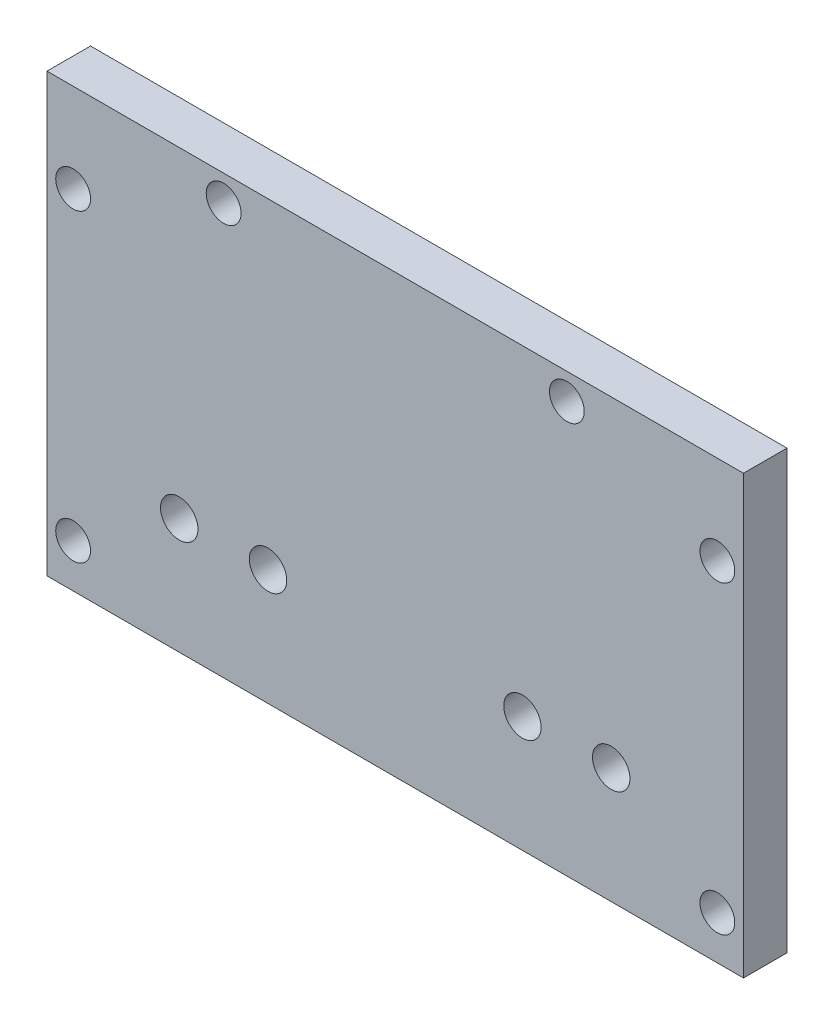
ISO-10303-21;
HEADER;
FILE_DESCRIPTION(('STEP AP214'),'2;1');
FILE_NAME('part.step','',(''),(''),'','','');
FILE_SCHEMA(('AUTOMOTIVE_DESIGN { 1 0 10303 214 1 1 1 1 }'));
ENDSEC;
DATA;
#1=APPLICATION_CONTEXT('core data for automotive mechanical design processes');
#2=APPLICATION_PROTOCOL_DEFINITION('international standard','automotive_design',2000,#1);
#3=PRODUCT_CONTEXT('',#1,'mechanical');
#4=PRODUCT('Part','Part','',(#3));
#5=PRODUCT_RELATED_PRODUCT_CATEGORY('part','',(#4));
#6=PRODUCT_DEFINITION_FORMATION('','',#4);
#7=PRODUCT_DEFINITION_CONTEXT('part definition',#1,'design');
#8=PRODUCT_DEFINITION('design','',#6,#7);
#9=PRODUCT_DEFINITION_SHAPE('','',#8);
#10=(LENGTH_UNIT() NAMED_UNIT(*) SI_UNIT(.MILLI.,.METRE.));
#11=(NAMED_UNIT(*) PLANE_ANGLE_UNIT() SI_UNIT($,.RADIAN.));
#12=(NAMED_UNIT(*) SI_UNIT($,.STERADIAN.) SOLID_ANGLE_UNIT());
#13=UNCERTAINTY_MEASURE_WITH_UNIT(LENGTH_MEASURE(1.E-05),#10,'distance_accuracy_value','');
#14=(GEOMETRIC_REPRESENTATION_CONTEXT(3) GLOBAL_UNCERTAINTY_ASSIGNED_CONTEXT((#13)) GLOBAL_UNIT_ASSIGNED_CONTEXT((#10,
#11,#12)) REPRESENTATION_CONTEXT('',''));
#15=CARTESIAN_POINT('',(0.,0.,0.));
#16=DIRECTION('',(0.,0.,1.));
#17=DIRECTION('',(1.,0.,0.));
#18=AXIS2_PLACEMENT_3D('',#15,#16,#17);
#19=CARTESIAN_POINT('',(0.,0.,5.));
#20=DIRECTION('',(0.,0.,-1.));
#21=DIRECTION('',(-1.,0.,0.));
#22=AXIS2_PLACEMENT_3D('',#19,#20,#21);
#23=PLANE('',#22);
#24=CARTESIAN_POINT('',(-37.,4.99999999999999,5.));
#25=DIRECTION('',(0.,0.,-1.));
#26=DIRECTION('',(-1.,0.,0.));
#27=AXIS2_PLACEMENT_3D('',#24,#25,#26);
#28=CIRCLE('',#27,2.);
#29=CARTESIAN_POINT('',(-39.,4.99999999999999,5.));
#30=VERTEX_POINT('',#29);
#31=EDGE_CURVE('E133',#30,#30,#28,.T.);
#32=ORIENTED_EDGE('',*,*,#31,.T.);
#33=EDGE_LOOP('',(#32));
#34=FACE_BOUND('',#33,.T.);
#35=CARTESIAN_POINT('',(37.,40.,5.));
#36=DIRECTION('',(0.,0.,-1.));
#37=DIRECTION('',(-1.,0.,0.));
#38=AXIS2_PLACEMENT_3D('',#35,#36,#37);
#39=CIRCLE('',#38,2.);
#40=CARTESIAN_POINT('',(35.,40.,5.));
#41=VERTEX_POINT('',#40);
#42=EDGE_CURVE('E138',#41,#41,#39,.T.);
#43=ORIENTED_EDGE('',*,*,#42,.T.);
#44=EDGE_LOOP('',(#43));
#45=FACE_BOUND('',#44,.T.);
#46=CARTESIAN_POINT('',(-37.,40.,5.));
#47=DIRECTION('',(0.,0.,-1.));
#48=DIRECTION('',(-1.,0.,0.));
#49=AXIS2_PLACEMENT_3D('',#46,#47,#48);
#50=CIRCLE('',#49,2.);
#51=CARTESIAN_POINT('',(-39.,40.,5.));
#52=VERTEX_POINT('',#51);
#53=EDGE_CURVE('E141',#52,#52,#50,.T.);
#54=ORIENTED_EDGE('',*,*,#53,.T.);
#55=EDGE_LOOP('',(#54));
#56=FACE_BOUND('',#55,.T.);
#57=CARTESIAN_POINT('',(19.7107385273617,47.2111998450075,5.));
#58=DIRECTION('',(0.,0.,-1.));
#59=DIRECTION('',(-1.,0.,0.));
#60=AXIS2_PLACEMENT_3D('',#57,#58,#59);
#61=CIRCLE('',#60,2.);
#62=CARTESIAN_POINT('',(17.7107385273617,47.2111998450075,5.));
#63=VERTEX_POINT('',#62);
#64=EDGE_CURVE('E144',#63,#63,#61,.T.);
#65=ORIENTED_EDGE('',*,*,#64,.T.);
#66=EDGE_LOOP('',(#65));
#67=FACE_BOUND('',#66,.T.);
#68=CARTESIAN_POINT('',(37.,4.99999999999998,5.));
#69=DIRECTION('',(0.,0.,-1.));
#70=DIRECTION('',(-1.,0.,0.));
#71=AXIS2_PLACEMENT_3D('',#68,#69,#70);
#72=CIRCLE('',#71,2.);
#73=CARTESIAN_POINT('',(35.,4.99999999999998,5.));
#74=VERTEX_POINT('',#73);
#75=EDGE_CURVE('E147',#74,#74,#72,.T.);
#76=ORIENTED_EDGE('',*,*,#75,.T.);
#77=EDGE_LOOP('',(#76));
#78=FACE_BOUND('',#77,.T.);
#79=CARTESIAN_POINT('',(-19.7107385273617,47.2111998450075,5.));
#80=DIRECTION('',(0.,0.,-1.));
#81=DIRECTION('',(-1.,0.,0.));
#82=AXIS2_PLACEMENT_3D('',#79,#80,#81);
#83=CIRCLE('',#82,2.);
#84=CARTESIAN_POINT('',(-21.7107385273617,47.2111998450075,5.));
#85=VERTEX_POINT('',#84);
#86=EDGE_CURVE('E150',#85,#85,#83,.T.);
#87=ORIENTED_EDGE('',*,*,#86,.T.);
#88=EDGE_LOOP('',(#87));
#89=FACE_BOUND('',#88,.T.);
#90=DIRECTION('',(0.,-1.,0.));
#91=VECTOR('',#90,1.);
#92=CARTESIAN_POINT('',(-40.,0.,5.));
#93=LINE('',#92,#91);
#94=CARTESIAN_POINT('',(-40.,50.2111998450075,5.));
#95=VERTEX_POINT('',#94);
#96=CARTESIAN_POINT('',(-40.,0.,5.));
#97=VERTEX_POINT('',#96);
#98=EDGE_CURVE('E85',#95,#97,#93,.T.);
#99=ORIENTED_EDGE('',*,*,#98,.T.);
#100=DIRECTION('',(1.,0.,0.));
#101=VECTOR('',#100,1.);
#102=CARTESIAN_POINT('',(40.,0.,5.));
#103=LINE('',#102,#101);
#104=CARTESIAN_POINT('',(40.,0.,5.));
#105=VERTEX_POINT('',#104);
#106=EDGE_CURVE('E80',#97,#105,#103,.T.);
#107=ORIENTED_EDGE('',*,*,#106,.T.);
#108=DIRECTION('',(0.,1.,0.));
#109=VECTOR('',#108,1.);
#110=CARTESIAN_POINT('',(40.,50.2111998450075,5.));
#111=LINE('',#110,#109);
#112=CARTESIAN_POINT('',(40.,50.2111998450075,5.));
#113=VERTEX_POINT('',#112);
#114=EDGE_CURVE('E83',#105,#113,#111,.T.);
#115=ORIENTED_EDGE('',*,*,#114,.T.);
#116=DIRECTION('',(-1.,0.,0.));
#117=VECTOR('',#116,1.);
#118=CARTESIAN_POINT('',(-40.,50.2111998450075,5.));
#119=LINE('',#118,#117);
#120=EDGE_CURVE('E50',#113,#95,#119,.T.);
#121=ORIENTED_EDGE('',*,*,#120,.T.);
#122=EDGE_LOOP('',(#99,#107,#115,#121));
#123=FACE_BOUND('',#122,.T.);
#124=CARTESIAN_POINT('',(14.6107385273617,13.3111998450076,5.));
#125=DIRECTION('',(0.,0.,1.));
#126=DIRECTION('',(1.,0.,0.));
#127=AXIS2_PLACEMENT_3D('',#124,#125,#126);
#128=CIRCLE('',#127,2.15);
#129=CARTESIAN_POINT('',(16.7607385273617,13.3111998450076,5.));
#130=VERTEX_POINT('',#129);
#131=EDGE_CURVE('E100',#130,#130,#128,.T.);
#132=ORIENTED_EDGE('',*,*,#131,.F.);
#133=EDGE_LOOP('',(#132));
#134=FACE_BOUND('',#133,.T.);
#135=CARTESIAN_POINT('',(24.8107385273617,13.3111998450076,5.));
#136=DIRECTION('',(0.,0.,1.));
#137=DIRECTION('',(1.,0.,0.));
#138=AXIS2_PLACEMENT_3D('',#135,#136,#137);
#139=CIRCLE('',#138,2.15);
#140=CARTESIAN_POINT('',(26.9607385273617,13.3111998450076,5.));
#141=VERTEX_POINT('',#140);
#142=EDGE_CURVE('E115',#141,#141,#139,.T.);
#143=ORIENTED_EDGE('',*,*,#142,.F.);
#144=EDGE_LOOP('',(#143));
#145=FACE_BOUND('',#144,.T.);
#146=CARTESIAN_POINT('',(-14.6107385273616,13.3111998450077,5.));
#147=DIRECTION('',(0.,0.,1.));
#148=DIRECTION('',(1.,0.,0.));
#149=AXIS2_PLACEMENT_3D('',#146,#147,#148);
#150=CIRCLE('',#149,2.15);
#151=CARTESIAN_POINT('',(-12.4607385273616,13.3111998450077,5.));
#152=VERTEX_POINT('',#151);
#153=EDGE_CURVE('E121',#152,#152,#150,.T.);
#154=ORIENTED_EDGE('',*,*,#153,.F.);
#155=EDGE_LOOP('',(#154));
#156=FACE_BOUND('',#155,.T.);
#157=CARTESIAN_POINT('',(-24.8107385273616,13.3111998450077,5.));
#158=DIRECTION('',(0.,0.,1.));
#159=DIRECTION('',(1.,0.,0.));
#160=AXIS2_PLACEMENT_3D('',#157,#158,#159);
#161=CIRCLE('',#160,2.15);
#162=CARTESIAN_POINT('',(-22.6607385273616,13.3111998450077,5.));
#163=VERTEX_POINT('',#162);
#164=EDGE_CURVE('E127',#163,#163,#161,.T.);
#165=ORIENTED_EDGE('',*,*,#164,.F.);
#166=EDGE_LOOP('',(#165));
#167=FACE_BOUND('',#166,.T.);
#168=ADVANCED_FACE('F33',(#34,#45,#56,#67,#78,#89,#123,#134,#145,#156,#167),#23,.F.);
#169=CARTESIAN_POINT('',(0.,0.,0.));
#170=DIRECTION('',(0.,0.,-1.));
#171=DIRECTION('',(-1.,0.,0.));
#172=AXIS2_PLACEMENT_3D('',#169,#170,#171);
#173=PLANE('',#172);
#174=CARTESIAN_POINT('',(-37.,4.99999999999999,0.));
#175=DIRECTION('',(0.,0.,-1.));
#176=DIRECTION('',(-1.,0.,0.));
#177=AXIS2_PLACEMENT_3D('',#174,#175,#176);
#178=CIRCLE('',#177,2.);
#179=CARTESIAN_POINT('',(-39.,4.99999999999999,0.));
#180=VERTEX_POINT('',#179);
#181=EDGE_CURVE('E163',#180,#180,#178,.T.);
#182=ORIENTED_EDGE('',*,*,#181,.F.);
#183=EDGE_LOOP('',(#182));
#184=FACE_BOUND('',#183,.T.);
#185=CARTESIAN_POINT('',(37.,40.,0.));
#186=DIRECTION('',(0.,0.,-1.));
#187=DIRECTION('',(-1.,0.,0.));
#188=AXIS2_PLACEMENT_3D('',#185,#186,#187);
#189=CIRCLE('',#188,2.);
#190=CARTESIAN_POINT('',(35.,40.,0.));
#191=VERTEX_POINT('',#190);
#192=EDGE_CURVE('E160',#191,#191,#189,.T.);
#193=ORIENTED_EDGE('',*,*,#192,.F.);
#194=EDGE_LOOP('',(#193));
#195=FACE_BOUND('',#194,.T.);
#196=CARTESIAN_POINT('',(-37.,40.,0.));
#197=DIRECTION('',(0.,0.,-1.));
#198=DIRECTION('',(-1.,0.,0.));
#199=AXIS2_PLACEMENT_3D('',#196,#197,#198);
#200=CIRCLE('',#199,2.);
#201=CARTESIAN_POINT('',(-39.,40.,0.));
#202=VERTEX_POINT('',#201);
#203=EDGE_CURVE('E157',#202,#202,#200,.T.);
#204=ORIENTED_EDGE('',*,*,#203,.F.);
#205=EDGE_LOOP('',(#204));
#206=FACE_BOUND('',#205,.T.);
#207=CARTESIAN_POINT('',(19.7107385273617,47.2111998450075,0.));
#208=DIRECTION('',(0.,0.,-1.));
#209=DIRECTION('',(1.,0.,0.));
#210=AXIS2_PLACEMENT_3D('',#207,#208,#209);
#211=CIRCLE('',#210,2.);
#212=CARTESIAN_POINT('',(21.7107385273617,47.2111998450075,0.));
#213=VERTEX_POINT('',#212);
#214=EDGE_CURVE('E156',#213,#213,#211,.T.);
#215=ORIENTED_EDGE('',*,*,#214,.F.);
#216=EDGE_LOOP('',(#215));
#217=FACE_BOUND('',#216,.T.);
#218=CARTESIAN_POINT('',(37.,4.99999999999998,0.));
#219=DIRECTION('',(0.,0.,-1.));
#220=DIRECTION('',(1.,0.,0.));
#221=AXIS2_PLACEMENT_3D('',#218,#219,#220);
#222=CIRCLE('',#221,2.);
#223=CARTESIAN_POINT('',(39.,4.99999999999998,0.));
#224=VERTEX_POINT('',#223);
#225=EDGE_CURVE('E166',#224,#224,#222,.T.);
#226=ORIENTED_EDGE('',*,*,#225,.F.);
#227=EDGE_LOOP('',(#226));
#228=FACE_BOUND('',#227,.T.);
#229=CARTESIAN_POINT('',(-19.7107385273617,47.2111998450075,0.));
#230=DIRECTION('',(0.,0.,-1.));
#231=DIRECTION('',(-1.,0.,0.));
#232=AXIS2_PLACEMENT_3D('',#229,#230,#231);
#233=CIRCLE('',#232,2.);
#234=CARTESIAN_POINT('',(-21.7107385273617,47.2111998450075,0.));
#235=VERTEX_POINT('',#234);
#236=EDGE_CURVE('E153',#235,#235,#233,.T.);
#237=ORIENTED_EDGE('',*,*,#236,.F.);
#238=EDGE_LOOP('',(#237));
#239=FACE_BOUND('',#238,.T.);
#240=CARTESIAN_POINT('',(-14.6107385273616,13.3111998450077,0.));
#241=DIRECTION('',(0.,0.,1.));
#242=DIRECTION('',(1.,0.,0.));
#243=AXIS2_PLACEMENT_3D('',#240,#241,#242);
#244=CIRCLE('',#243,2.15);
#245=CARTESIAN_POINT('',(-12.4607385273616,13.3111998450077,0.));
#246=VERTEX_POINT('',#245);
#247=EDGE_CURVE('E124',#246,#246,#244,.T.);
#248=ORIENTED_EDGE('',*,*,#247,.T.);
#249=EDGE_LOOP('',(#248));
#250=FACE_BOUND('',#249,.T.);
#251=CARTESIAN_POINT('',(14.6107385273617,13.3111998450076,0.));
#252=DIRECTION('',(0.,0.,1.));
#253=DIRECTION('',(1.,0.,0.));
#254=AXIS2_PLACEMENT_3D('',#251,#252,#253);
#255=CIRCLE('',#254,2.15);
#256=CARTESIAN_POINT('',(16.7607385273617,13.3111998450076,0.));
#257=VERTEX_POINT('',#256);
#258=EDGE_CURVE('E112',#257,#257,#255,.T.);
#259=ORIENTED_EDGE('',*,*,#258,.T.);
#260=EDGE_LOOP('',(#259));
#261=FACE_BOUND('',#260,.T.);
#262=DIRECTION('',(0.,-1.,0.));
#263=VECTOR('',#262,1.);
#264=CARTESIAN_POINT('',(-40.,0.,0.));
#265=LINE('',#264,#263);
#266=CARTESIAN_POINT('',(-40.,50.2111998450075,0.));
#267=VERTEX_POINT('',#266);
#268=CARTESIAN_POINT('',(-40.,0.,0.));
#269=VERTEX_POINT('',#268);
#270=EDGE_CURVE('E97',#267,#269,#265,.T.);
#271=ORIENTED_EDGE('',*,*,#270,.F.);
#272=DIRECTION('',(-1.,0.,0.));
#273=VECTOR('',#272,1.);
#274=CARTESIAN_POINT('',(-40.,50.2111998450075,0.));
#275=LINE('',#274,#273);
#276=CARTESIAN_POINT('',(40.,50.2111998450075,0.));
#277=VERTEX_POINT('',#276);
#278=EDGE_CURVE('E73',#277,#267,#275,.T.);
#279=ORIENTED_EDGE('',*,*,#278,.F.);
#280=DIRECTION('',(0.,1.,0.));
#281=VECTOR('',#280,1.);
#282=CARTESIAN_POINT('',(40.,50.2111998450075,0.));
#283=LINE('',#282,#281);
#284=CARTESIAN_POINT('',(40.,0.,0.));
#285=VERTEX_POINT('',#284);
#286=EDGE_CURVE('E67',#285,#277,#283,.T.);
#287=ORIENTED_EDGE('',*,*,#286,.F.);
#288=DIRECTION('',(1.,0.,0.));
#289=VECTOR('',#288,1.);
#290=CARTESIAN_POINT('',(40.,0.,0.));
#291=LINE('',#290,#289);
#292=EDGE_CURVE('E89',#269,#285,#291,.T.);
#293=ORIENTED_EDGE('',*,*,#292,.F.);
#294=EDGE_LOOP('',(#271,#279,#287,#293));
#295=FACE_BOUND('',#294,.T.);
#296=CARTESIAN_POINT('',(24.8107385273617,13.3111998450076,0.));
#297=DIRECTION('',(0.,0.,1.));
#298=DIRECTION('',(1.,0.,0.));
#299=AXIS2_PLACEMENT_3D('',#296,#297,#298);
#300=CIRCLE('',#299,2.15);
#301=CARTESIAN_POINT('',(26.9607385273617,13.3111998450076,0.));
#302=VERTEX_POINT('',#301);
#303=EDGE_CURVE('E118',#302,#302,#300,.T.);
#304=ORIENTED_EDGE('',*,*,#303,.T.);
#305=EDGE_LOOP('',(#304));
#306=FACE_BOUND('',#305,.T.);
#307=CARTESIAN_POINT('',(-24.8107385273616,13.3111998450077,0.));
#308=DIRECTION('',(0.,0.,1.));
#309=DIRECTION('',(1.,0.,0.));
#310=AXIS2_PLACEMENT_3D('',#307,#308,#309);
#311=CIRCLE('',#310,2.15);
#312=CARTESIAN_POINT('',(-22.6607385273616,13.3111998450077,0.));
#313=VERTEX_POINT('',#312);
#314=EDGE_CURVE('E130',#313,#313,#311,.T.);
#315=ORIENTED_EDGE('',*,*,#314,.T.);
#316=EDGE_LOOP('',(#315));
#317=FACE_BOUND('',#316,.T.);
#318=ADVANCED_FACE('F108',(#184,#195,#206,#217,#228,#239,#250,#261,#295,#306,#317),#173,.T.);
#319=CARTESIAN_POINT('',(-40.,0.,5.));
#320=DIRECTION('',(1.,0.,0.));
#321=DIRECTION('',(0.,1.,0.));
#322=AXIS2_PLACEMENT_3D('',#319,#320,#321);
#323=PLANE('',#322);
#324=ORIENTED_EDGE('',*,*,#270,.T.);
#325=DIRECTION('',(0.,0.,-1.));
#326=VECTOR('',#325,1.);
#327=CARTESIAN_POINT('',(-40.,0.,5.));
#328=LINE('',#327,#326);
#329=EDGE_CURVE('E11',#97,#269,#328,.T.);
#330=ORIENTED_EDGE('',*,*,#329,.F.);
#331=ORIENTED_EDGE('',*,*,#98,.F.);
#332=DIRECTION('',(0.,0.,-1.));
#333=VECTOR('',#332,1.);
#334=CARTESIAN_POINT('',(-40.,50.2111998450075,5.));
#335=LINE('',#334,#333);
#336=EDGE_CURVE('E93',#95,#267,#335,.T.);
#337=ORIENTED_EDGE('',*,*,#336,.T.);
#338=EDGE_LOOP('',(#324,#330,#331,#337));
#339=FACE_BOUND('',#338,.T.);
#340=ADVANCED_FACE('F35',(#339),#323,.F.);
#341=CARTESIAN_POINT('',(40.,0.,5.));
#342=DIRECTION('',(0.,1.,0.));
#343=DIRECTION('',(-1.,0.,0.));
#344=AXIS2_PLACEMENT_3D('',#341,#342,#343);
#345=PLANE('',#344);
#346=ORIENTED_EDGE('',*,*,#292,.T.);
#347=DIRECTION('',(0.,0.,-1.));
#348=VECTOR('',#347,1.);
#349=CARTESIAN_POINT('',(40.,0.,5.));
#350=LINE('',#349,#348);
#351=EDGE_CURVE('E42',#105,#285,#350,.T.);
#352=ORIENTED_EDGE('',*,*,#351,.F.);
#353=ORIENTED_EDGE('',*,*,#106,.F.);
#354=ORIENTED_EDGE('',*,*,#329,.T.);
#355=EDGE_LOOP('',(#346,#352,#353,#354));
#356=FACE_BOUND('',#355,.T.);
#357=ADVANCED_FACE('F88',(#356),#345,.F.);
#358=CARTESIAN_POINT('',(40.,50.2111998450075,5.));
#359=DIRECTION('',(-1.,0.,0.));
#360=DIRECTION('',(0.,0.,1.));
#361=AXIS2_PLACEMENT_3D('',#358,#359,#360);
#362=PLANE('',#361);
#363=ORIENTED_EDGE('',*,*,#286,.T.);
#364=DIRECTION('',(0.,0.,-1.));
#365=VECTOR('',#364,1.);
#366=CARTESIAN_POINT('',(40.,50.2111998450075,5.));
#367=LINE('',#366,#365);
#368=EDGE_CURVE('E90',#113,#277,#367,.T.);
#369=ORIENTED_EDGE('',*,*,#368,.F.);
#370=ORIENTED_EDGE('',*,*,#114,.F.);
#371=ORIENTED_EDGE('',*,*,#351,.T.);
#372=EDGE_LOOP('',(#363,#369,#370,#371));
#373=FACE_BOUND('',#372,.T.);
#374=ADVANCED_FACE('F91',(#373),#362,.F.);
#375=CARTESIAN_POINT('',(-40.,50.2111998450075,5.));
#376=DIRECTION('',(0.,-1.,0.));
#377=DIRECTION('',(1.,0.,0.));
#378=AXIS2_PLACEMENT_3D('',#375,#376,#377);
#379=PLANE('',#378);
#380=ORIENTED_EDGE('',*,*,#278,.T.);
#381=ORIENTED_EDGE('',*,*,#336,.F.);
#382=ORIENTED_EDGE('',*,*,#120,.F.);
#383=ORIENTED_EDGE('',*,*,#368,.T.);
#384=EDGE_LOOP('',(#380,#381,#382,#383));
#385=FACE_BOUND('',#384,.T.);
#386=ADVANCED_FACE('F105',(#385),#379,.F.);
#387=CARTESIAN_POINT('',(14.6107385273617,13.3111998450076,5.));
#388=DIRECTION('',(0.,0.,-1.));
#389=DIRECTION('',(-1.,0.,0.));
#390=AXIS2_PLACEMENT_3D('',#387,#388,#389);
#391=CYLINDRICAL_SURFACE('',#390,2.15);
#392=ORIENTED_EDGE('',*,*,#131,.T.);
#393=EDGE_LOOP('',(#392));
#394=FACE_BOUND('',#393,.T.);
#395=ORIENTED_EDGE('',*,*,#258,.F.);
#396=EDGE_LOOP('',(#395));
#397=FACE_BOUND('',#396,.T.);
#398=ADVANCED_FACE('F185',(#394,#397),#391,.F.);
#399=CARTESIAN_POINT('',(24.8107385273617,13.3111998450076,5.));
#400=DIRECTION('',(0.,0.,-1.));
#401=DIRECTION('',(-1.,0.,0.));
#402=AXIS2_PLACEMENT_3D('',#399,#400,#401);
#403=CYLINDRICAL_SURFACE('',#402,2.15);
#404=ORIENTED_EDGE('',*,*,#142,.T.);
#405=EDGE_LOOP('',(#404));
#406=FACE_BOUND('',#405,.T.);
#407=ORIENTED_EDGE('',*,*,#303,.F.);
#408=EDGE_LOOP('',(#407));
#409=FACE_BOUND('',#408,.T.);
#410=ADVANCED_FACE('F187',(#406,#409),#403,.F.);
#411=CARTESIAN_POINT('',(-14.6107385273616,13.3111998450077,5.));
#412=DIRECTION('',(0.,0.,-1.));
#413=DIRECTION('',(-1.,0.,0.));
#414=AXIS2_PLACEMENT_3D('',#411,#412,#413);
#415=CYLINDRICAL_SURFACE('',#414,2.15);
#416=ORIENTED_EDGE('',*,*,#153,.T.);
#417=EDGE_LOOP('',(#416));
#418=FACE_BOUND('',#417,.T.);
#419=ORIENTED_EDGE('',*,*,#247,.F.);
#420=EDGE_LOOP('',(#419));
#421=FACE_BOUND('',#420,.T.);
#422=ADVANCED_FACE('F194',(#418,#421),#415,.F.);
#423=CARTESIAN_POINT('',(-24.8107385273616,13.3111998450077,5.));
#424=DIRECTION('',(0.,0.,-1.));
#425=DIRECTION('',(-1.,0.,0.));
#426=AXIS2_PLACEMENT_3D('',#423,#424,#425);
#427=CYLINDRICAL_SURFACE('',#426,2.15);
#428=ORIENTED_EDGE('',*,*,#164,.T.);
#429=EDGE_LOOP('',(#428));
#430=FACE_BOUND('',#429,.T.);
#431=ORIENTED_EDGE('',*,*,#314,.F.);
#432=EDGE_LOOP('',(#431));
#433=FACE_BOUND('',#432,.T.);
#434=ADVANCED_FACE('F229',(#430,#433),#427,.F.);
#435=CARTESIAN_POINT('',(-19.7107385273617,47.2111998450075,10.));
#436=DIRECTION('',(0.,0.,-1.));
#437=DIRECTION('',(-1.,0.,0.));
#438=AXIS2_PLACEMENT_3D('',#435,#436,#437);
#439=CYLINDRICAL_SURFACE('',#438,2.);
#440=ORIENTED_EDGE('',*,*,#236,.T.);
#441=EDGE_LOOP('',(#440));
#442=FACE_BOUND('',#441,.T.);
#443=ORIENTED_EDGE('',*,*,#86,.F.);
#444=EDGE_LOOP('',(#443));
#445=FACE_BOUND('',#444,.T.);
#446=ADVANCED_FACE('F224',(#442,#445),#439,.F.);
#447=CARTESIAN_POINT('',(37.,4.99999999999998,10.));
#448=DIRECTION('',(0.,0.,-1.));
#449=DIRECTION('',(-1.,0.,0.));
#450=AXIS2_PLACEMENT_3D('',#447,#448,#449);
#451=CYLINDRICAL_SURFACE('',#450,2.);
#452=ORIENTED_EDGE('',*,*,#225,.T.);
#453=EDGE_LOOP('',(#452));
#454=FACE_BOUND('',#453,.T.);
#455=ORIENTED_EDGE('',*,*,#75,.F.);
#456=EDGE_LOOP('',(#455));
#457=FACE_BOUND('',#456,.T.);
#458=ADVANCED_FACE('F172',(#454,#457),#451,.F.);
#459=CARTESIAN_POINT('',(19.7107385273617,47.2111998450075,10.));
#460=DIRECTION('',(0.,0.,-1.));
#461=DIRECTION('',(-1.,0.,0.));
#462=AXIS2_PLACEMENT_3D('',#459,#460,#461);
#463=CYLINDRICAL_SURFACE('',#462,2.);
#464=ORIENTED_EDGE('',*,*,#214,.T.);
#465=EDGE_LOOP('',(#464));
#466=FACE_BOUND('',#465,.T.);
#467=ORIENTED_EDGE('',*,*,#64,.F.);
#468=EDGE_LOOP('',(#467));
#469=FACE_BOUND('',#468,.T.);
#470=ADVANCED_FACE('F241',(#466,#469),#463,.F.);
#471=CARTESIAN_POINT('',(-37.,40.,10.));
#472=DIRECTION('',(0.,0.,-1.));
#473=DIRECTION('',(-1.,0.,0.));
#474=AXIS2_PLACEMENT_3D('',#471,#472,#473);
#475=CYLINDRICAL_SURFACE('',#474,2.);
#476=ORIENTED_EDGE('',*,*,#203,.T.);
#477=EDGE_LOOP('',(#476));
#478=FACE_BOUND('',#477,.T.);
#479=ORIENTED_EDGE('',*,*,#53,.F.);
#480=EDGE_LOOP('',(#479));
#481=FACE_BOUND('',#480,.T.);
#482=ADVANCED_FACE('F250',(#478,#481),#475,.F.);
#483=CARTESIAN_POINT('',(37.,40.,10.));
#484=DIRECTION('',(0.,0.,-1.));
#485=DIRECTION('',(-1.,0.,0.));
#486=AXIS2_PLACEMENT_3D('',#483,#484,#485);
#487=CYLINDRICAL_SURFACE('',#486,2.);
#488=ORIENTED_EDGE('',*,*,#192,.T.);
#489=EDGE_LOOP('',(#488));
#490=FACE_BOUND('',#489,.T.);
#491=ORIENTED_EDGE('',*,*,#42,.F.);
#492=EDGE_LOOP('',(#491));
#493=FACE_BOUND('',#492,.T.);
#494=ADVANCED_FACE('F260',(#490,#493),#487,.F.);
#495=CARTESIAN_POINT('',(-37.,4.99999999999999,10.));
#496=DIRECTION('',(0.,0.,-1.));
#497=DIRECTION('',(-1.,0.,0.));
#498=AXIS2_PLACEMENT_3D('',#495,#496,#497);
#499=CYLINDRICAL_SURFACE('',#498,2.);
#500=ORIENTED_EDGE('',*,*,#181,.T.);
#501=EDGE_LOOP('',(#500));
#502=FACE_BOUND('',#501,.T.);
#503=ORIENTED_EDGE('',*,*,#31,.F.);
#504=EDGE_LOOP('',(#503));
#505=FACE_BOUND('',#504,.T.);
#506=ADVANCED_FACE('F270',(#502,#505),#499,.F.);
#507=CLOSED_SHELL('',(#168,#318,#340,#357,#374,#386,#398,#410,#422,#434,#446,#458,#470,#482,
#494,#506));
#508=MANIFOLD_SOLID_BREP('B2',#507);
#509=ADVANCED_BREP_SHAPE_REPRESENTATION('',(#18,#508),#14);
#510=SHAPE_DEFINITION_REPRESENTATION(#9,#509);
ENDSEC;
END-ISO-10303-21;
